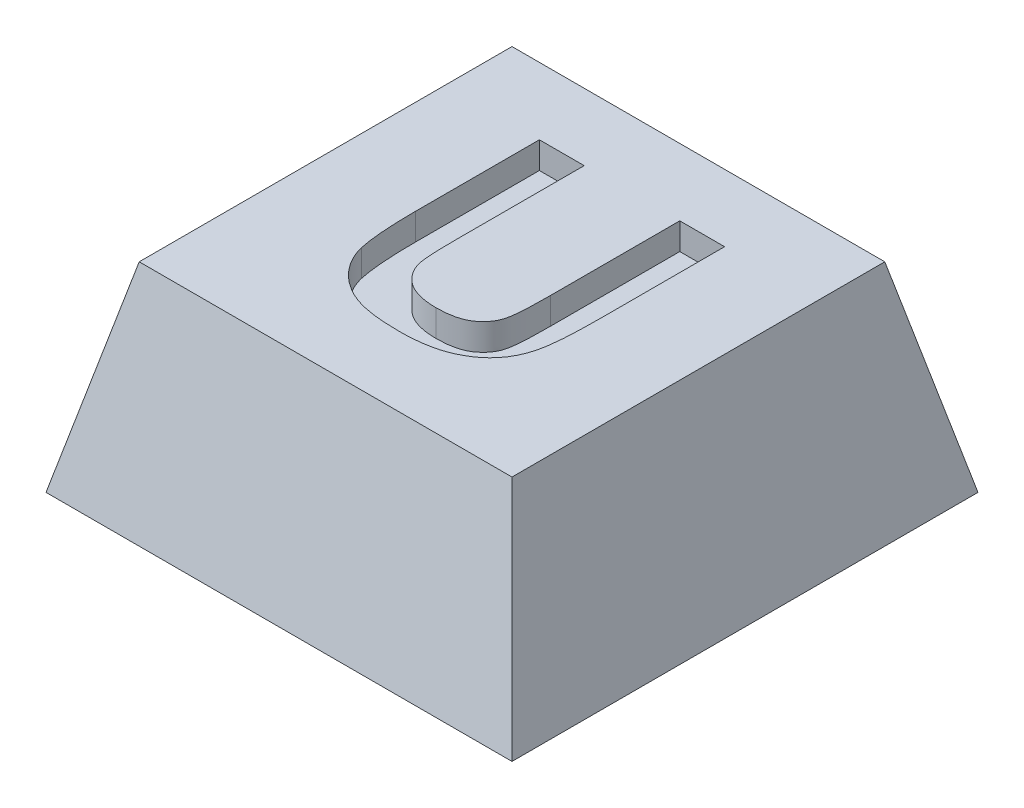
ISO-10303-21;
HEADER;
FILE_DESCRIPTION(('STEP AP214'),'2;1');
FILE_NAME('part.step','',(''),(''),'','','');
FILE_SCHEMA(('AUTOMOTIVE_DESIGN { 1 0 10303 214 1 1 1 1 }'));
ENDSEC;
DATA;
#1=APPLICATION_CONTEXT('core data for automotive mechanical design processes');
#2=APPLICATION_PROTOCOL_DEFINITION('international standard','automotive_design',2000,#1);
#3=PRODUCT_CONTEXT('',#1,'mechanical');
#4=PRODUCT('Part','Part','',(#3));
#5=PRODUCT_RELATED_PRODUCT_CATEGORY('part','',(#4));
#6=PRODUCT_DEFINITION_FORMATION('','',#4);
#7=PRODUCT_DEFINITION_CONTEXT('part definition',#1,'design');
#8=PRODUCT_DEFINITION('design','',#6,#7);
#9=PRODUCT_DEFINITION_SHAPE('','',#8);
#10=(LENGTH_UNIT() NAMED_UNIT(*) SI_UNIT(.MILLI.,.METRE.));
#11=(NAMED_UNIT(*) PLANE_ANGLE_UNIT() SI_UNIT($,.RADIAN.));
#12=(NAMED_UNIT(*) SI_UNIT($,.STERADIAN.) SOLID_ANGLE_UNIT());
#13=UNCERTAINTY_MEASURE_WITH_UNIT(LENGTH_MEASURE(1.E-05),#10,'distance_accuracy_value','');
#14=(GEOMETRIC_REPRESENTATION_CONTEXT(3) GLOBAL_UNCERTAINTY_ASSIGNED_CONTEXT((#13)) GLOBAL_UNIT_ASSIGNED_CONTEXT((#10,
#11,#12)) REPRESENTATION_CONTEXT('',''));
#15=CARTESIAN_POINT('',(0.,0.,0.));
#16=DIRECTION('',(0.,0.,1.));
#17=DIRECTION('',(1.,0.,0.));
#18=AXIS2_PLACEMENT_3D('',#15,#16,#17);
#19=CARTESIAN_POINT('',(0.,3.,0.));
#20=DIRECTION('',(0.,-1.,0.));
#21=DIRECTION('',(0.,0.,-1.));
#22=AXIS2_PLACEMENT_3D('',#19,#20,#21);
#23=PLANE('',#22);
#24=DIRECTION('',(-1.,0.,0.));
#25=VECTOR('',#24,1.);
#26=CARTESIAN_POINT('',(11.,3.,-0.7));
#27=LINE('',#26,#25);
#28=CARTESIAN_POINT('',(6.3,3.,-0.7));
#29=VERTEX_POINT('',#28);
#30=CARTESIAN_POINT('',(0.7,3.,-0.7));
#31=VERTEX_POINT('',#30);
#32=EDGE_CURVE('E66',#29,#31,#27,.T.);
#33=ORIENTED_EDGE('',*,*,#32,.F.);
#34=DIRECTION('',(0.,0.,1.));
#35=VECTOR('',#34,1.);
#36=CARTESIAN_POINT('',(6.3,3.,-7.));
#37=LINE('',#36,#35);
#38=CARTESIAN_POINT('',(6.3,3.,-6.3));
#39=VERTEX_POINT('',#38);
#40=EDGE_CURVE('E207',#39,#29,#37,.T.);
#41=ORIENTED_EDGE('',*,*,#40,.F.);
#42=DIRECTION('',(-1.,0.,0.));
#43=VECTOR('',#42,1.);
#44=CARTESIAN_POINT('',(11.,3.,-6.3));
#45=LINE('',#44,#43);
#46=CARTESIAN_POINT('',(0.699999999999998,3.,-6.3));
#47=VERTEX_POINT('',#46);
#48=EDGE_CURVE('E194',#39,#47,#45,.T.);
#49=ORIENTED_EDGE('',*,*,#48,.T.);
#50=DIRECTION('',(0.,0.,1.));
#51=VECTOR('',#50,1.);
#52=CARTESIAN_POINT('',(0.7,3.,-7.));
#53=LINE('',#52,#51);
#54=EDGE_CURVE('E208',#47,#31,#53,.T.);
#55=ORIENTED_EDGE('',*,*,#54,.T.);
#56=EDGE_LOOP('',(#33,#41,#49,#55));
#57=FACE_BOUND('',#56,.T.);
#58=DIRECTION('',(0.,0.,-1.));
#59=VECTOR('',#58,1.);
#60=CARTESIAN_POINT('',(2.11825671053354,3.,-3.43364218970727));
#61=LINE('',#60,#59);
#62=CARTESIAN_POINT('',(2.11825671053354,3.,-3.43364218970727));
#63=VERTEX_POINT('',#62);
#64=CARTESIAN_POINT('',(2.11825671053354,3.,-5.29301718970727));
#65=VERTEX_POINT('',#64);
#66=EDGE_CURVE('E59',#63,#65,#61,.T.);
#67=ORIENTED_EDGE('',*,*,#66,.T.);
#68=DIRECTION('',(1.,0.,0.));
#69=VECTOR('',#68,1.);
#70=CARTESIAN_POINT('',(2.11825671053354,3.,-5.29301718970727));
#71=LINE('',#70,#69);
#72=CARTESIAN_POINT('',(2.79133363361046,3.,-5.29301718970727));
#73=VERTEX_POINT('',#72);
#74=EDGE_CURVE('E178',#65,#73,#71,.T.);
#75=ORIENTED_EDGE('',*,*,#74,.T.);
#76=DIRECTION('',(0.,0.,1.));
#77=VECTOR('',#76,1.);
#78=CARTESIAN_POINT('',(2.79133363361046,3.,-5.29301718970727));
#79=LINE('',#78,#77);
#80=CARTESIAN_POINT('',(2.79133363361046,3.,-3.39367824739958));
#81=VERTEX_POINT('',#80);
#82=EDGE_CURVE('E562',#73,#81,#79,.T.);
#83=ORIENTED_EDGE('',*,*,#82,.T.);
#84=CARTESIAN_POINT('',(2.79133363361046,3.,-3.39367824739958));
#85=CARTESIAN_POINT('',(2.79159058951141,3.,-3.35768736847698));
#86=CARTESIAN_POINT('',(2.79208114272012,3.,-3.28897736386237));
#87=CARTESIAN_POINT('',(2.7924188179936,3.,-3.1908119289973));
#88=CARTESIAN_POINT('',(2.79428755370598,3.,-3.10267455181293));
#89=CARTESIAN_POINT('',(2.79834009069351,3.,-3.02442321187944));
#90=CARTESIAN_POINT('',(2.80112145876494,3.,-2.95609781623993));
#91=CARTESIAN_POINT('',(2.80628615700011,3.,-2.89768582464791));
#92=CARTESIAN_POINT('',(2.81143833836728,3.,-2.84920998529375));
#93=CARTESIAN_POINT('',(2.8164474963245,3.,-2.82037615527109));
#94=CARTESIAN_POINT('',(2.81867738361046,3.,-2.80754042688676));
#95=B_SPLINE_CURVE_WITH_KNOTS('',3,(#84,#85,#86,#87,#88,#89,#90,#91,#92,#93,#94),.UNSPECIFIED.,
.F.,.F.,(4,1,1,1,1,1,1,1,4),(0.,0.183825007060264,0.350939389686892,0.501381121480457,
0.634009924722663,0.75113916001217,0.85056330440193,0.933476446457445,1.),.UNSPECIFIED.);
#96=CARTESIAN_POINT('',(2.81867738361046,3.,-2.80754042688676));
#97=VERTEX_POINT('',#96);
#98=EDGE_CURVE('E557',#81,#97,#95,.T.);
#99=ORIENTED_EDGE('',*,*,#98,.T.);
#100=CARTESIAN_POINT('',(2.81867738361046,3.,-2.80754042688676));
#101=CARTESIAN_POINT('',(2.8278706557609,3.,-2.77293717894445));
#102=CARTESIAN_POINT('',(2.84597336928102,3.,-2.70479901506601));
#103=CARTESIAN_POINT('',(2.89587110487312,3.,-2.61165595386306));
#104=CARTESIAN_POINT('',(2.96178530901125,3.,-2.52955621095545));
#105=CARTESIAN_POINT('',(3.02902022735564,3.,-2.47100587847671));
#106=CARTESIAN_POINT('',(3.08983939033886,3.,-2.42956829777976));
#107=CARTESIAN_POINT('',(3.14150028578501,3.,-2.40434878879185));
#108=CARTESIAN_POINT('',(3.19631215864889,3.,-2.38135958467606));
#109=CARTESIAN_POINT('',(3.25543376065886,3.,-2.36372016282051));
#110=CARTESIAN_POINT('',(3.3182305632906,3.,-2.34828503435642));
#111=CARTESIAN_POINT('',(3.38546108562211,3.,-2.33936033475784));
#112=CARTESIAN_POINT('',(3.45655794152469,3.,-2.33251084984938));
#113=CARTESIAN_POINT('',(3.50529030878881,3.,-2.33182892125537));
#114=CARTESIAN_POINT('',(3.53031600540534,3.,-2.33147872816881));
#115=B_SPLINE_CURVE_WITH_KNOTS('',3,(#100,#101,#102,#103,#104,#105,#106,#107,#108,#109,#110,
#111,#112,#113,#114),.UNSPECIFIED.,.F.,.F.,(4,1,1,1,1,1,1,1,1,1,1,1,4),(0.,0.114743421271191,
0.22594428290622,0.336552611577657,0.451504771280934,0.511079547906043,0.572546352604733,
0.635866479310683,0.701907532163574,0.770586403165963,0.843449734748019,0.919606215265516,1.),.UNSPECIFIED.);
#116=CARTESIAN_POINT('',(3.53031600540534,3.,-2.33147872816881));
#117=VERTEX_POINT('',#116);
#118=EDGE_CURVE('E547',#97,#117,#115,.T.);
#119=ORIENTED_EDGE('',*,*,#118,.T.);
#120=CARTESIAN_POINT('',(3.53031600540534,3.,-2.33147872816881));
#121=CARTESIAN_POINT('',(3.55556419717022,3.,-2.33193665140718));
#122=CARTESIAN_POINT('',(3.60472191096495,3.,-2.33282821860144));
#123=CARTESIAN_POINT('',(3.67595983039916,3.,-2.33813781258919));
#124=CARTESIAN_POINT('',(3.74242359123935,3.,-2.34815518597234));
#125=CARTESIAN_POINT('',(3.80407253527364,3.,-2.36128989700301));
#126=CARTESIAN_POINT('',(3.8612322702574,3.,-2.37788997047793));
#127=CARTESIAN_POINT('',(3.91344678502505,3.,-2.39890761477416));
#128=CARTESIAN_POINT('',(3.960633796973,3.,-2.42420044434323));
#129=CARTESIAN_POINT('',(4.01607782452567,3.,-2.46232298827674));
#130=CARTESIAN_POINT('',(4.07573552578467,3.,-2.51610149189697));
#131=CARTESIAN_POINT('',(4.13314844621875,3.,-2.58922023729159));
#132=CARTESIAN_POINT('',(4.17423842475938,3.,-2.66993537802751));
#133=CARTESIAN_POINT('',(4.19351136611538,3.,-2.74363433884562));
#134=CARTESIAN_POINT('',(4.20341701063227,3.,-2.80784598051888));
#135=CARTESIAN_POINT('',(4.20945206203609,3.,-2.86403339665256));
#136=CARTESIAN_POINT('',(4.21497142158267,3.,-2.92761805574264));
#137=CARTESIAN_POINT('',(4.21998342224808,3.,-2.99842580037893));
#138=CARTESIAN_POINT('',(4.22341098794886,3.,-3.07650978009094));
#139=CARTESIAN_POINT('',(4.22526489824002,3.,-3.16206747441928));
#140=CARTESIAN_POINT('',(4.2267239353615,3.,-3.25508523863521));
#141=CARTESIAN_POINT('',(4.22705799518012,3.,-3.31959241422902));
#142=CARTESIAN_POINT('',(4.2272310695079,3.,-3.35301318329701));
#143=B_SPLINE_CURVE_WITH_KNOTS('',3,(#120,#121,#122,#123,#124,#125,#126,#127,#128,#129,#130,
#131,#132,#133,#134,#135,#136,#137,#138,#139,#140,#141,#142),.UNSPECIFIED.,.F.,.F.,(4,1,1,1,1,1,
1,1,1,1,1,1,1,1,1,1,1,1,1,1,4),(0.,0.0518438119306666,0.100938843171358,0.146542287812453,
0.189742133284701,0.230280246580349,0.268596217760667,0.30509323438548,0.33996418344798,
0.406554529976919,0.469135901134995,0.529866816686716,0.591101794550841,0.624629557038698,
0.663259733719709,0.707094516041552,0.755675646503373,0.808993028944534,0.86755245054543,
0.931379743056552,1.),.UNSPECIFIED.);
#144=CARTESIAN_POINT('',(4.2272310695079,3.,-3.35301318329701));
#145=VERTEX_POINT('',#144);
#146=EDGE_CURVE('E556',#117,#145,#143,.T.);
#147=ORIENTED_EDGE('',*,*,#146,.T.);
#148=DIRECTION('',(0.,0.,-1.));
#149=VECTOR('',#148,1.);
#150=CARTESIAN_POINT('',(4.2272310695079,3.,-3.35301318329701));
#151=LINE('',#150,#149);
#152=CARTESIAN_POINT('',(4.2272310695079,3.,-5.29301718970727));
#153=VERTEX_POINT('',#152);
#154=EDGE_CURVE('E583',#145,#153,#151,.T.);
#155=ORIENTED_EDGE('',*,*,#154,.T.);
#156=DIRECTION('',(1.,0.,0.));
#157=VECTOR('',#156,1.);
#158=CARTESIAN_POINT('',(4.2272310695079,3.,-5.29301718970727));
#159=LINE('',#158,#157);
#160=CARTESIAN_POINT('',(4.90030799258482,3.,-5.29301718970727));
#161=VERTEX_POINT('',#160);
#162=EDGE_CURVE('E590',#153,#161,#159,.T.);
#163=ORIENTED_EDGE('',*,*,#162,.T.);
#164=DIRECTION('',(0.,0.,1.));
#165=VECTOR('',#164,1.);
#166=CARTESIAN_POINT('',(4.90030799258482,3.,-5.29301718970727));
#167=LINE('',#166,#165);
#168=CARTESIAN_POINT('',(4.90030799258482,3.,-3.46238818329701));
#169=VERTEX_POINT('',#168);
#170=EDGE_CURVE('E594',#161,#169,#167,.T.);
#171=ORIENTED_EDGE('',*,*,#170,.T.);
#172=CARTESIAN_POINT('',(4.90030799258482,3.,-3.46238818329702));
#173=CARTESIAN_POINT('',(4.90022172292996,3.,-3.41190690880102));
#174=CARTESIAN_POINT('',(4.90005595815898,3.,-3.31490852717624));
#175=CARTESIAN_POINT('',(4.89746777177614,3.,-3.17535205677515));
#176=CARTESIAN_POINT('',(4.89196705444676,3.,-3.04731484577185));
#177=CARTESIAN_POINT('',(4.88736067837094,3.,-2.93057741913428));
#178=CARTESIAN_POINT('',(4.87847516828992,3.,-2.82543758612459));
#179=CARTESIAN_POINT('',(4.86917206958176,3.,-2.73182997491537));
#180=CARTESIAN_POINT('',(4.85718756009229,3.,-2.6497709447995));
#181=CARTESIAN_POINT('',(4.84009753799659,3.,-2.55649893221663));
#182=CARTESIAN_POINT('',(4.81137664457265,3.,-2.45185373531345));
#183=CARTESIAN_POINT('',(4.76508843933388,3.,-2.33625969489549));
#184=CARTESIAN_POINT('',(4.70593072162474,3.,-2.23109386202453));
#185=CARTESIAN_POINT('',(4.63413922319297,3.,-2.1359527261188));
#186=CARTESIAN_POINT('',(4.55012752072571,3.,-2.05045814604782));
#187=CARTESIAN_POINT('',(4.45263771682141,3.,-1.97494622981607));
#188=CARTESIAN_POINT('',(4.34267229471177,3.,-1.90849896532287));
#189=CARTESIAN_POINT('',(4.24190168528171,3.,-1.86065278262511));
#190=CARTESIAN_POINT('',(4.15404262439026,3.,-1.82843473114555));
#191=CARTESIAN_POINT('',(4.08248288856089,3.,-1.80663099759483));
#192=CARTESIAN_POINT('',(4.00589756293172,3.,-1.78847304918121));
#193=CARTESIAN_POINT('',(3.92437646854737,3.,-1.77406310214242));
#194=CARTESIAN_POINT('',(3.83788457654613,3.,-1.76191338502257));
#195=CARTESIAN_POINT('',(3.74639048357668,3.,-1.75379936468534));
#196=CARTESIAN_POINT('',(3.65003261148225,3.,-1.74873564371268));
#197=CARTESIAN_POINT('',(3.58430909343863,3.,-1.74834530720141));
#198=CARTESIAN_POINT('',(3.55064853745662,3.,-1.74814539483548));
#199=B_SPLINE_CURVE_WITH_KNOTS('',3,(#172,#173,#174,#175,#176,#177,#178,#179,#180,#181,#182,
#183,#184,#185,#186,#187,#188,#189,#190,#191,#192,#193,#194,#195,#196,#197,#198),.UNSPECIFIED.,
.F.,.F.,(4,1,1,1,1,1,1,1,1,1,1,1,1,1,1,1,1,1,1,1,1,1,1,1,4),(0.,0.058982251866515,
0.113332776019573,0.163066996848931,0.208720820432053,0.249811139834419,0.286329176157329,
0.318613036661102,0.346676161329656,0.397089399385359,0.445108917572501,0.49181547303063,
0.537635583766378,0.583977529790645,0.631444968953472,0.681319919045405,0.733844646315688,
0.761490173539024,0.790600539422322,0.821199444835878,0.853389629847076,0.887295661622406,
0.923216688702173,0.960675127787456,1.),.UNSPECIFIED.);
#200=CARTESIAN_POINT('',(3.55064853745662,3.,-1.74814539483548));
#201=VERTEX_POINT('',#200);
#202=EDGE_CURVE('E598',#169,#201,#199,.T.);
#203=ORIENTED_EDGE('',*,*,#202,.T.);
#204=CARTESIAN_POINT('',(3.55064853745662,3.,-1.74814539483548));
#205=CARTESIAN_POINT('',(3.51021434728701,3.,-1.74866224884397));
#206=CARTESIAN_POINT('',(3.43188729339117,3.,-1.74966347210602));
#207=CARTESIAN_POINT('',(3.31818906285651,3.,-1.75412984327711));
#208=CARTESIAN_POINT('',(3.21225124567553,3.,-1.76334860404892));
#209=CARTESIAN_POINT('',(3.11374100494762,3.,-1.77580862242184));
#210=CARTESIAN_POINT('',(3.02269901356326,3.,-1.79182638346425));
#211=CARTESIAN_POINT('',(2.93889495671294,3.,-1.81097551662833));
#212=CARTESIAN_POINT('',(2.86299788741923,3.,-1.83517731887616));
#213=CARTESIAN_POINT('',(2.77259838705882,3.,-1.86974334383618));
#214=CARTESIAN_POINT('',(2.67183306408483,3.,-1.9226177742413));
#215=CARTESIAN_POINT('',(2.56214574695217,3.,-1.9931518342703));
#216=CARTESIAN_POINT('',(2.46585914510612,3.,-2.0727620443855));
#217=CARTESIAN_POINT('',(2.3838192814199,3.,-2.16067051305769));
#218=CARTESIAN_POINT('',(2.31523714842208,3.,-2.2537879371028));
#219=CARTESIAN_POINT('',(2.25949199154255,3.,-2.35009935825425));
#220=CARTESIAN_POINT('',(2.21481965775545,3.,-2.44799948376074));
#221=CARTESIAN_POINT('',(2.19615302070669,3.,-2.51604198706442));
#222=CARTESIAN_POINT('',(2.18696664643098,3.,-2.54952760637394));
#223=B_SPLINE_CURVE_WITH_KNOTS('',3,(#204,#205,#206,#207,#208,#209,#210,#211,#212,#213,#214,
#215,#216,#217,#218,#219,#220,#221,#222),.UNSPECIFIED.,.F.,.F.,(4,1,1,1,1,1,1,1,1,1,1,1,1,1,1,1,
4),(0.,0.0705383458906594,0.136643291163387,0.198429902465619,0.25597418052394,
0.309794976232589,0.359633117755365,0.405792277216816,0.448642759284464,0.528318939757397,
0.603739881743586,0.675824581819639,0.745623938691081,0.812974235955688,0.877093332418524,
0.939514190668938,1.),.UNSPECIFIED.);
#224=CARTESIAN_POINT('',(2.18696664643098,3.,-2.54952760637394));
#225=VERTEX_POINT('',#224);
#226=EDGE_CURVE('E604',#201,#225,#223,.T.);
#227=ORIENTED_EDGE('',*,*,#226,.T.);
#228=CARTESIAN_POINT('',(2.18696664643098,3.,-2.54952760637394));
#229=CARTESIAN_POINT('',(2.18134426175389,3.,-2.57589046465025));
#230=CARTESIAN_POINT('',(2.16950172171168,3.,-2.63141907442974));
#231=CARTESIAN_POINT('',(2.15605188340251,3.,-2.71969867853388));
#232=CARTESIAN_POINT('',(2.14378166796499,3.,-2.8169093080754));
#233=CARTESIAN_POINT('',(2.13540095063567,3.,-2.92316594646986));
#234=CARTESIAN_POINT('',(2.12745679825847,3.,-3.03813146097455));
#235=CARTESIAN_POINT('',(2.12175317795555,3.,-3.16202261990794));
#236=CARTESIAN_POINT('',(2.11940784408804,3.,-3.2948112910508));
#237=CARTESIAN_POINT('',(2.1186481518535,3.,-3.38643294104239));
#238=CARTESIAN_POINT('',(2.11825671053354,3.,-3.43364218970727));
#239=B_SPLINE_CURVE_WITH_KNOTS('',3,(#228,#229,#230,#231,#232,#233,#234,#235,#236,#237,#238),
.UNSPECIFIED.,.F.,.F.,(4,1,1,1,1,1,1,1,4),(0.,0.0910089497500999,0.191693950790411,
0.301427787431466,0.421825191502953,0.55154595606244,0.690589809294284,0.840572368716176,1.),.UNSPECIFIED.);
#240=EDGE_CURVE('E174',#225,#63,#239,.T.);
#241=ORIENTED_EDGE('',*,*,#240,.T.);
#242=EDGE_LOOP('',(#67,#75,#83,#99,#119,#147,#155,#163,#171,#203,#227,#241));
#243=FACE_BOUND('',#242,.T.);
#244=ADVANCED_FACE('F43',(#57,#243),#23,.F.);
#245=CARTESIAN_POINT('',(7.,0.,-7.));
#246=DIRECTION('',(-0.973841209741793,-0.227229615606418,0.));
#247=DIRECTION('',(0.227229615606418,-0.973841209741793,0.));
#248=AXIS2_PLACEMENT_3D('',#245,#246,#247);
#249=PLANE('',#248);
#250=DIRECTION('',(-0.221581128241521,0.949633406749377,-0.221581128241521));
#251=VECTOR('',#250,1.);
#252=CARTESIAN_POINT('',(6.6563126252505,1.47294589178357,-0.343687374749499));
#253=LINE('',#252,#251);
#254=CARTESIAN_POINT('',(7.,0.,0.));
#255=VERTEX_POINT('',#254);
#256=EDGE_CURVE('E204',#255,#29,#253,.T.);
#257=ORIENTED_EDGE('',*,*,#256,.F.);
#258=DIRECTION('',(0.,0.,-1.));
#259=VECTOR('',#258,1.);
#260=CARTESIAN_POINT('',(7.,0.,0.));
#261=LINE('',#260,#259);
#262=CARTESIAN_POINT('',(7.,0.,-7.));
#263=VERTEX_POINT('',#262);
#264=EDGE_CURVE('E222',#255,#263,#261,.T.);
#265=ORIENTED_EDGE('',*,*,#264,.T.);
#266=DIRECTION('',(0.221581128241521,-0.949633406749377,-0.221581128241521));
#267=VECTOR('',#266,1.);
#268=CARTESIAN_POINT('',(7.,0.,-7.));
#269=LINE('',#268,#267);
#270=EDGE_CURVE('E198',#39,#263,#269,.T.);
#271=ORIENTED_EDGE('',*,*,#270,.F.);
#272=ORIENTED_EDGE('',*,*,#40,.T.);
#273=EDGE_LOOP('',(#257,#265,#271,#272));
#274=FACE_BOUND('',#273,.T.);
#275=ADVANCED_FACE('F247',(#274),#249,.F.);
#276=CARTESIAN_POINT('',(0.,0.,-7.));
#277=DIRECTION('',(0.973841209741793,-0.227229615606418,0.));
#278=DIRECTION('',(0.227229615606418,0.973841209741793,0.));
#279=AXIS2_PLACEMENT_3D('',#276,#277,#278);
#280=PLANE('',#279);
#281=DIRECTION('',(-0.221581128241521,-0.949633406749378,0.221581128241521));
#282=VECTOR('',#281,1.);
#283=CARTESIAN_POINT('',(0.343687374749499,1.47294589178357,-0.3436873747495));
#284=LINE('',#283,#282);
#285=CARTESIAN_POINT('',(0.,0.,0.));
#286=VERTEX_POINT('',#285);
#287=EDGE_CURVE('E11',#31,#286,#284,.T.);
#288=ORIENTED_EDGE('',*,*,#287,.F.);
#289=ORIENTED_EDGE('',*,*,#54,.F.);
#290=DIRECTION('',(0.221581128241521,0.949633406749377,0.221581128241521));
#291=VECTOR('',#290,1.);
#292=CARTESIAN_POINT('',(0.,0.,-7.));
#293=LINE('',#292,#291);
#294=CARTESIAN_POINT('',(0.,0.,-7.));
#295=VERTEX_POINT('',#294);
#296=EDGE_CURVE('E52',#295,#47,#293,.T.);
#297=ORIENTED_EDGE('',*,*,#296,.F.);
#298=DIRECTION('',(0.,0.,1.));
#299=VECTOR('',#298,1.);
#300=CARTESIAN_POINT('',(0.,0.,0.));
#301=LINE('',#300,#299);
#302=EDGE_CURVE('E212',#295,#286,#301,.T.);
#303=ORIENTED_EDGE('',*,*,#302,.T.);
#304=EDGE_LOOP('',(#288,#289,#297,#303));
#305=FACE_BOUND('',#304,.T.);
#306=ADVANCED_FACE('F240',(#305),#280,.F.);
#307=CARTESIAN_POINT('',(0.,0.,0.));
#308=DIRECTION('',(0.,-1.,0.));
#309=DIRECTION('',(0.,0.,-1.));
#310=AXIS2_PLACEMENT_3D('',#307,#308,#309);
#311=PLANE('',#310);
#312=CARTESIAN_POINT('',(3.5,0.,-3.5));
#313=DIRECTION('',(0.,-1.,0.));
#314=DIRECTION('',(0.,0.,-1.));
#315=AXIS2_PLACEMENT_3D('',#312,#313,#314);
#316=CIRCLE('',#315,1.8);
#317=CARTESIAN_POINT('',(3.5,0.,-5.3));
#318=VERTEX_POINT('',#317);
#319=EDGE_CURVE('E180',#318,#318,#316,.T.);
#320=ORIENTED_EDGE('',*,*,#319,.F.);
#321=EDGE_LOOP('',(#320));
#322=FACE_BOUND('',#321,.T.);
#323=ORIENTED_EDGE('',*,*,#302,.F.);
#324=DIRECTION('',(-1.,0.,0.));
#325=VECTOR('',#324,1.);
#326=CARTESIAN_POINT('',(0.,0.,-7.));
#327=LINE('',#326,#325);
#328=EDGE_CURVE('E226',#263,#295,#327,.T.);
#329=ORIENTED_EDGE('',*,*,#328,.F.);
#330=ORIENTED_EDGE('',*,*,#264,.F.);
#331=DIRECTION('',(1.,0.,0.));
#332=VECTOR('',#331,1.);
#333=CARTESIAN_POINT('',(0.,0.,0.));
#334=LINE('',#333,#332);
#335=EDGE_CURVE('E219',#286,#255,#334,.T.);
#336=ORIENTED_EDGE('',*,*,#335,.F.);
#337=EDGE_LOOP('',(#323,#329,#330,#336));
#338=FACE_BOUND('',#337,.T.);
#339=ADVANCED_FACE('F45',(#322,#338),#311,.T.);
#340=CARTESIAN_POINT('',(11.,3.,-6.3));
#341=DIRECTION('',(0.,0.227229615606418,-0.973841209741793));
#342=DIRECTION('',(0.,0.973841209741793,0.227229615606418));
#343=AXIS2_PLACEMENT_3D('',#340,#341,#342);
#344=PLANE('',#343);
#345=ORIENTED_EDGE('',*,*,#270,.T.);
#346=ORIENTED_EDGE('',*,*,#328,.T.);
#347=ORIENTED_EDGE('',*,*,#296,.T.);
#348=ORIENTED_EDGE('',*,*,#48,.F.);
#349=EDGE_LOOP('',(#345,#346,#347,#348));
#350=FACE_BOUND('',#349,.T.);
#351=ADVANCED_FACE('F231',(#350),#344,.T.);
#352=CARTESIAN_POINT('',(11.,0.,0.));
#353=DIRECTION('',(0.,0.227229615606418,0.973841209741793));
#354=DIRECTION('',(0.,-0.973841209741793,0.227229615606418));
#355=AXIS2_PLACEMENT_3D('',#352,#353,#354);
#356=PLANE('',#355);
#357=ORIENTED_EDGE('',*,*,#256,.T.);
#358=ORIENTED_EDGE('',*,*,#32,.T.);
#359=ORIENTED_EDGE('',*,*,#287,.T.);
#360=ORIENTED_EDGE('',*,*,#335,.T.);
#361=EDGE_LOOP('',(#357,#358,#359,#360));
#362=FACE_BOUND('',#361,.T.);
#363=ADVANCED_FACE('F242',(#362),#356,.T.);
#364=CARTESIAN_POINT('',(3.5,0.8,-3.5));
#365=DIRECTION('',(0.,-1.,0.));
#366=DIRECTION('',(0.,0.,-1.));
#367=AXIS2_PLACEMENT_3D('',#364,#365,#366);
#368=CYLINDRICAL_SURFACE('',#367,1.8);
#369=CARTESIAN_POINT('',(3.5,0.8,-3.5));
#370=DIRECTION('',(0.,-1.,0.));
#371=DIRECTION('',(0.,0.,-1.));
#372=AXIS2_PLACEMENT_3D('',#369,#370,#371);
#373=CIRCLE('',#372,1.8);
#374=CARTESIAN_POINT('',(3.5,0.8,-5.3));
#375=VERTEX_POINT('',#374);
#376=EDGE_CURVE('E186',#375,#375,#373,.T.);
#377=ORIENTED_EDGE('',*,*,#376,.F.);
#378=EDGE_LOOP('',(#377));
#379=FACE_BOUND('',#378,.T.);
#380=ORIENTED_EDGE('',*,*,#319,.T.);
#381=EDGE_LOOP('',(#380));
#382=FACE_BOUND('',#381,.T.);
#383=ADVANCED_FACE('F265',(#379,#382),#368,.F.);
#384=CARTESIAN_POINT('',(3.5,0.8,-3.5));
#385=DIRECTION('',(0.,-1.,0.));
#386=DIRECTION('',(0.,0.,-1.));
#387=AXIS2_PLACEMENT_3D('',#384,#385,#386);
#388=PLANE('',#387);
#389=ORIENTED_EDGE('',*,*,#376,.T.);
#390=EDGE_LOOP('',(#389));
#391=FACE_BOUND('',#390,.T.);
#392=ADVANCED_FACE('F268',(#391),#388,.T.);
#393=CARTESIAN_POINT('',(2.11825671053354,2.6,-3.43364218970727));
#394=DIRECTION('',(1.,0.,0.));
#395=DIRECTION('',(0.,0.,-1.));
#396=AXIS2_PLACEMENT_3D('',#393,#394,#395);
#397=PLANE('',#396);
#398=ORIENTED_EDGE('',*,*,#66,.F.);
#399=DIRECTION('',(0.,1.,0.));
#400=VECTOR('',#399,1.);
#401=CARTESIAN_POINT('',(2.11825671053354,2.6,-3.43364218970727));
#402=LINE('',#401,#400);
#403=CARTESIAN_POINT('',(2.11825671053354,2.6,-3.43364218970727));
#404=VERTEX_POINT('',#403);
#405=EDGE_CURVE('E172',#404,#63,#402,.T.);
#406=ORIENTED_EDGE('',*,*,#405,.F.);
#407=DIRECTION('',(0.,0.,-1.));
#408=VECTOR('',#407,1.);
#409=CARTESIAN_POINT('',(2.11825671053354,2.6,-3.43364218970727));
#410=LINE('',#409,#408);
#411=CARTESIAN_POINT('',(2.11825671053354,2.6,-5.29301718970727));
#412=VERTEX_POINT('',#411);
#413=EDGE_CURVE('E162',#404,#412,#410,.T.);
#414=ORIENTED_EDGE('',*,*,#413,.T.);
#415=DIRECTION('',(0.,1.,0.));
#416=VECTOR('',#415,1.);
#417=CARTESIAN_POINT('',(2.11825671053354,2.6,-5.29301718970727));
#418=LINE('',#417,#416);
#419=EDGE_CURVE('E171',#412,#65,#418,.T.);
#420=ORIENTED_EDGE('',*,*,#419,.T.);
#421=EDGE_LOOP('',(#398,#406,#414,#420));
#422=FACE_BOUND('',#421,.T.);
#423=ADVANCED_FACE('F170',(#422),#397,.T.);
#424=CARTESIAN_POINT('',(2.11825671053354,2.6,-5.29301718970727));
#425=DIRECTION('',(0.,0.,1.));
#426=DIRECTION('',(1.,0.,0.));
#427=AXIS2_PLACEMENT_3D('',#424,#425,#426);
#428=PLANE('',#427);
#429=ORIENTED_EDGE('',*,*,#74,.F.);
#430=ORIENTED_EDGE('',*,*,#419,.F.);
#431=DIRECTION('',(1.,0.,0.));
#432=VECTOR('',#431,1.);
#433=CARTESIAN_POINT('',(2.11825671053354,2.6,-5.29301718970727));
#434=LINE('',#433,#432);
#435=CARTESIAN_POINT('',(2.79133363361046,2.6,-5.29301718970727));
#436=VERTEX_POINT('',#435);
#437=EDGE_CURVE('E158',#412,#436,#434,.T.);
#438=ORIENTED_EDGE('',*,*,#437,.T.);
#439=DIRECTION('',(0.,1.,0.));
#440=VECTOR('',#439,1.);
#441=CARTESIAN_POINT('',(2.79133363361046,2.6,-5.29301718970727));
#442=LINE('',#441,#440);
#443=EDGE_CURVE('E181',#436,#73,#442,.T.);
#444=ORIENTED_EDGE('',*,*,#443,.T.);
#445=EDGE_LOOP('',(#429,#430,#438,#444));
#446=FACE_BOUND('',#445,.T.);
#447=ADVANCED_FACE('F176',(#446),#428,.T.);
#448=CARTESIAN_POINT('',(2.79133363361046,2.6,-5.29301718970727));
#449=DIRECTION('',(-1.,0.,0.));
#450=DIRECTION('',(0.,0.,1.));
#451=AXIS2_PLACEMENT_3D('',#448,#449,#450);
#452=PLANE('',#451);
#453=ORIENTED_EDGE('',*,*,#82,.F.);
#454=ORIENTED_EDGE('',*,*,#443,.F.);
#455=DIRECTION('',(0.,0.,1.));
#456=VECTOR('',#455,1.);
#457=CARTESIAN_POINT('',(2.79133363361046,2.6,-5.29301718970727));
#458=LINE('',#457,#456);
#459=CARTESIAN_POINT('',(2.79133363361046,2.6,-3.39367824739958));
#460=VERTEX_POINT('',#459);
#461=EDGE_CURVE('E164',#436,#460,#458,.T.);
#462=ORIENTED_EDGE('',*,*,#461,.T.);
#463=DIRECTION('',(0.,1.,0.));
#464=VECTOR('',#463,1.);
#465=CARTESIAN_POINT('',(2.79133363361046,2.6,-3.39367824739958));
#466=LINE('',#465,#464);
#467=EDGE_CURVE('E188',#460,#81,#466,.T.);
#468=ORIENTED_EDGE('',*,*,#467,.T.);
#469=EDGE_LOOP('',(#453,#454,#462,#468));
#470=FACE_BOUND('',#469,.T.);
#471=ADVANCED_FACE('F277',(#470),#452,.T.);
#472=CARTESIAN_POINT('',(2.79133363361046,2.6,-3.39367824739958));
#473=CARTESIAN_POINT('',(2.79159058951141,2.6,-3.35768736847698));
#474=CARTESIAN_POINT('',(2.79208114272012,2.6,-3.28897736386237));
#475=CARTESIAN_POINT('',(2.7924188179936,2.6,-3.1908119289973));
#476=CARTESIAN_POINT('',(2.79428755370598,2.6,-3.10267455181293));
#477=CARTESIAN_POINT('',(2.79834009069351,2.6,-3.02442321187944));
#478=CARTESIAN_POINT('',(2.80112145876494,2.6,-2.95609781623993));
#479=CARTESIAN_POINT('',(2.80628615700011,2.6,-2.89768582464791));
#480=CARTESIAN_POINT('',(2.81143833836728,2.6,-2.84920998529375));
#481=CARTESIAN_POINT('',(2.8164474963245,2.6,-2.82037615527109));
#482=CARTESIAN_POINT('',(2.81867738361046,2.6,-2.80754042688676));
#483=B_SPLINE_CURVE_WITH_KNOTS('',3,(#472,#473,#474,#475,#476,#477,#478,#479,#480,#481,#482),
.UNSPECIFIED.,.F.,.F.,(4,1,1,1,1,1,1,1,4),(0.,0.183825007060264,0.350939389686892,
0.501381121480457,0.634009924722663,0.75113916001217,0.85056330440193,0.933476446457445,1.),.UNSPECIFIED.);
#484=DIRECTION('',(0.,1.,0.));
#485=VECTOR('',#484,1.);
#486=SURFACE_OF_LINEAR_EXTRUSION('',#483,#485);
#487=ORIENTED_EDGE('',*,*,#98,.F.);
#488=ORIENTED_EDGE('',*,*,#467,.F.);
#489=CARTESIAN_POINT('',(2.81867738361046,2.6,-2.80754042688676));
#490=VERTEX_POINT('',#489);
#491=EDGE_CURVE('E289',#460,#490,#483,.T.);
#492=ORIENTED_EDGE('',*,*,#491,.T.);
#493=DIRECTION('',(0.,1.,0.));
#494=VECTOR('',#493,1.);
#495=CARTESIAN_POINT('',(2.81867738361046,2.6,-2.80754042688676));
#496=LINE('',#495,#494);
#497=EDGE_CURVE('E549',#490,#97,#496,.T.);
#498=ORIENTED_EDGE('',*,*,#497,.T.);
#499=EDGE_LOOP('',(#487,#488,#492,#498));
#500=FACE_BOUND('',#499,.T.);
#501=ADVANCED_FACE('F280',(#500),#486,.T.);
#502=CARTESIAN_POINT('',(2.81867738361046,2.6,-2.80754042688676));
#503=CARTESIAN_POINT('',(2.8278706557609,2.6,-2.77293717894445));
#504=CARTESIAN_POINT('',(2.84597336928102,2.6,-2.70479901506601));
#505=CARTESIAN_POINT('',(2.89587110487312,2.6,-2.61165595386306));
#506=CARTESIAN_POINT('',(2.96178530901125,2.6,-2.52955621095545));
#507=CARTESIAN_POINT('',(3.02902022735564,2.6,-2.47100587847671));
#508=CARTESIAN_POINT('',(3.08983939033886,2.6,-2.42956829777976));
#509=CARTESIAN_POINT('',(3.14150028578501,2.6,-2.40434878879185));
#510=CARTESIAN_POINT('',(3.19631215864889,2.6,-2.38135958467606));
#511=CARTESIAN_POINT('',(3.25543376065886,2.6,-2.36372016282051));
#512=CARTESIAN_POINT('',(3.3182305632906,2.6,-2.34828503435642));
#513=CARTESIAN_POINT('',(3.38546108562211,2.6,-2.33936033475784));
#514=CARTESIAN_POINT('',(3.45655794152469,2.6,-2.33251084984938));
#515=CARTESIAN_POINT('',(3.50529030878881,2.6,-2.33182892125537));
#516=CARTESIAN_POINT('',(3.53031600540534,2.6,-2.33147872816881));
#517=B_SPLINE_CURVE_WITH_KNOTS('',3,(#502,#503,#504,#505,#506,#507,#508,#509,#510,#511,#512,
#513,#514,#515,#516),.UNSPECIFIED.,.F.,.F.,(4,1,1,1,1,1,1,1,1,1,1,1,4),(0.,0.114743421271191,
0.22594428290622,0.336552611577657,0.451504771280934,0.511079547906043,0.572546352604733,
0.635866479310683,0.701907532163574,0.770586403165963,0.843449734748019,0.919606215265516,1.),.UNSPECIFIED.);
#518=DIRECTION('',(0.,1.,0.));
#519=VECTOR('',#518,1.);
#520=SURFACE_OF_LINEAR_EXTRUSION('',#517,#519);
#521=ORIENTED_EDGE('',*,*,#118,.F.);
#522=ORIENTED_EDGE('',*,*,#497,.F.);
#523=CARTESIAN_POINT('',(3.53031600540534,2.6,-2.33147872816881));
#524=VERTEX_POINT('',#523);
#525=EDGE_CURVE('E295',#490,#524,#517,.T.);
#526=ORIENTED_EDGE('',*,*,#525,.T.);
#527=DIRECTION('',(0.,1.,0.));
#528=VECTOR('',#527,1.);
#529=CARTESIAN_POINT('',(3.53031600540534,2.6,-2.33147872816881));
#530=LINE('',#529,#528);
#531=EDGE_CURVE('E552',#524,#117,#530,.T.);
#532=ORIENTED_EDGE('',*,*,#531,.T.);
#533=EDGE_LOOP('',(#521,#522,#526,#532));
#534=FACE_BOUND('',#533,.T.);
#535=ADVANCED_FACE('F285',(#534),#520,.T.);
#536=CARTESIAN_POINT('',(3.53031600540534,2.6,-2.33147872816881));
#537=CARTESIAN_POINT('',(3.55556419717022,2.6,-2.33193665140718));
#538=CARTESIAN_POINT('',(3.60472191096495,2.6,-2.33282821860144));
#539=CARTESIAN_POINT('',(3.67595983039916,2.6,-2.33813781258919));
#540=CARTESIAN_POINT('',(3.74242359123935,2.6,-2.34815518597234));
#541=CARTESIAN_POINT('',(3.80407253527364,2.6,-2.36128989700301));
#542=CARTESIAN_POINT('',(3.8612322702574,2.6,-2.37788997047793));
#543=CARTESIAN_POINT('',(3.91344678502505,2.6,-2.39890761477416));
#544=CARTESIAN_POINT('',(3.960633796973,2.6,-2.42420044434323));
#545=CARTESIAN_POINT('',(4.01607782452567,2.6,-2.46232298827674));
#546=CARTESIAN_POINT('',(4.07573552578467,2.6,-2.51610149189697));
#547=CARTESIAN_POINT('',(4.13314844621875,2.6,-2.58922023729159));
#548=CARTESIAN_POINT('',(4.17423842475938,2.6,-2.66993537802751));
#549=CARTESIAN_POINT('',(4.19351136611538,2.6,-2.74363433884562));
#550=CARTESIAN_POINT('',(4.20341701063227,2.6,-2.80784598051888));
#551=CARTESIAN_POINT('',(4.20945206203609,2.6,-2.86403339665256));
#552=CARTESIAN_POINT('',(4.21497142158267,2.6,-2.92761805574264));
#553=CARTESIAN_POINT('',(4.21998342224808,2.6,-2.99842580037893));
#554=CARTESIAN_POINT('',(4.22341098794886,2.6,-3.07650978009094));
#555=CARTESIAN_POINT('',(4.22526489824002,2.6,-3.16206747441928));
#556=CARTESIAN_POINT('',(4.2267239353615,2.6,-3.25508523863521));
#557=CARTESIAN_POINT('',(4.22705799518012,2.6,-3.31959241422902));
#558=CARTESIAN_POINT('',(4.2272310695079,2.6,-3.35301318329701));
#559=B_SPLINE_CURVE_WITH_KNOTS('',3,(#536,#537,#538,#539,#540,#541,#542,#543,#544,#545,#546,
#547,#548,#549,#550,#551,#552,#553,#554,#555,#556,#557,#558),.UNSPECIFIED.,.F.,.F.,(4,1,1,1,1,1,
1,1,1,1,1,1,1,1,1,1,1,1,1,1,4),(0.,0.0518438119306666,0.100938843171358,0.146542287812453,
0.189742133284701,0.230280246580349,0.268596217760667,0.30509323438548,0.33996418344798,
0.406554529976919,0.469135901134995,0.529866816686716,0.591101794550841,0.624629557038698,
0.663259733719709,0.707094516041552,0.755675646503373,0.808993028944534,0.86755245054543,
0.931379743056552,1.),.UNSPECIFIED.);
#560=DIRECTION('',(0.,1.,0.));
#561=VECTOR('',#560,1.);
#562=SURFACE_OF_LINEAR_EXTRUSION('',#559,#561);
#563=ORIENTED_EDGE('',*,*,#146,.F.);
#564=ORIENTED_EDGE('',*,*,#531,.F.);
#565=CARTESIAN_POINT('',(4.2272310695079,2.6,-3.35301318329701));
#566=VERTEX_POINT('',#565);
#567=EDGE_CURVE('E304',#524,#566,#559,.T.);
#568=ORIENTED_EDGE('',*,*,#567,.T.);
#569=DIRECTION('',(0.,1.,0.));
#570=VECTOR('',#569,1.);
#571=CARTESIAN_POINT('',(4.2272310695079,2.6,-3.35301318329701));
#572=LINE('',#571,#570);
#573=EDGE_CURVE('E641',#566,#145,#572,.T.);
#574=ORIENTED_EDGE('',*,*,#573,.T.);
#575=EDGE_LOOP('',(#563,#564,#568,#574));
#576=FACE_BOUND('',#575,.T.);
#577=ADVANCED_FACE('F318',(#576),#562,.T.);
#578=CARTESIAN_POINT('',(4.2272310695079,2.6,-3.35301318329701));
#579=DIRECTION('',(1.,0.,0.));
#580=DIRECTION('',(0.,0.,-1.));
#581=AXIS2_PLACEMENT_3D('',#578,#579,#580);
#582=PLANE('',#581);
#583=ORIENTED_EDGE('',*,*,#154,.F.);
#584=ORIENTED_EDGE('',*,*,#573,.F.);
#585=DIRECTION('',(0.,0.,-1.));
#586=VECTOR('',#585,1.);
#587=CARTESIAN_POINT('',(4.2272310695079,2.6,-3.35301318329701));
#588=LINE('',#587,#586);
#589=CARTESIAN_POINT('',(4.2272310695079,2.6,-5.29301718970727));
#590=VERTEX_POINT('',#589);
#591=EDGE_CURVE('E313',#566,#590,#588,.T.);
#592=ORIENTED_EDGE('',*,*,#591,.T.);
#593=DIRECTION('',(0.,1.,0.));
#594=VECTOR('',#593,1.);
#595=CARTESIAN_POINT('',(4.2272310695079,2.6,-5.29301718970727));
#596=LINE('',#595,#594);
#597=EDGE_CURVE('E638',#590,#153,#596,.T.);
#598=ORIENTED_EDGE('',*,*,#597,.T.);
#599=EDGE_LOOP('',(#583,#584,#592,#598));
#600=FACE_BOUND('',#599,.T.);
#601=ADVANCED_FACE('F321',(#600),#582,.T.);
#602=CARTESIAN_POINT('',(4.2272310695079,2.6,-5.29301718970727));
#603=DIRECTION('',(0.,0.,1.));
#604=DIRECTION('',(1.,0.,0.));
#605=AXIS2_PLACEMENT_3D('',#602,#603,#604);
#606=PLANE('',#605);
#607=ORIENTED_EDGE('',*,*,#162,.F.);
#608=ORIENTED_EDGE('',*,*,#597,.F.);
#609=DIRECTION('',(1.,0.,0.));
#610=VECTOR('',#609,1.);
#611=CARTESIAN_POINT('',(4.2272310695079,2.6,-5.29301718970727));
#612=LINE('',#611,#610);
#613=CARTESIAN_POINT('',(4.90030799258482,2.6,-5.29301718970727));
#614=VERTEX_POINT('',#613);
#615=EDGE_CURVE('E657',#590,#614,#612,.T.);
#616=ORIENTED_EDGE('',*,*,#615,.T.);
#617=DIRECTION('',(0.,1.,0.));
#618=VECTOR('',#617,1.);
#619=CARTESIAN_POINT('',(4.90030799258482,2.6,-5.29301718970727));
#620=LINE('',#619,#618);
#621=EDGE_CURVE('E635',#614,#161,#620,.T.);
#622=ORIENTED_EDGE('',*,*,#621,.T.);
#623=EDGE_LOOP('',(#607,#608,#616,#622));
#624=FACE_BOUND('',#623,.T.);
#625=ADVANCED_FACE('F325',(#624),#606,.T.);
#626=CARTESIAN_POINT('',(4.90030799258482,2.6,-5.29301718970727));
#627=DIRECTION('',(-1.,0.,0.));
#628=DIRECTION('',(0.,0.,1.));
#629=AXIS2_PLACEMENT_3D('',#626,#627,#628);
#630=PLANE('',#629);
#631=ORIENTED_EDGE('',*,*,#170,.F.);
#632=ORIENTED_EDGE('',*,*,#621,.F.);
#633=DIRECTION('',(0.,0.,1.));
#634=VECTOR('',#633,1.);
#635=CARTESIAN_POINT('',(4.90030799258482,2.6,-5.29301718970727));
#636=LINE('',#635,#634);
#637=CARTESIAN_POINT('',(4.90030799258482,2.6,-3.46238818329701));
#638=VERTEX_POINT('',#637);
#639=EDGE_CURVE('E349',#614,#638,#636,.T.);
#640=ORIENTED_EDGE('',*,*,#639,.T.);
#641=DIRECTION('',(0.,1.,0.));
#642=VECTOR('',#641,1.);
#643=CARTESIAN_POINT('',(4.90030799258482,2.6,-3.46238818329701));
#644=LINE('',#643,#642);
#645=EDGE_CURVE('E632',#638,#169,#644,.T.);
#646=ORIENTED_EDGE('',*,*,#645,.T.);
#647=EDGE_LOOP('',(#631,#632,#640,#646));
#648=FACE_BOUND('',#647,.T.);
#649=ADVANCED_FACE('F329',(#648),#630,.T.);
#650=CARTESIAN_POINT('',(4.90030799258482,2.6,-3.46238818329702));
#651=CARTESIAN_POINT('',(4.90022172292996,2.6,-3.41190690880102));
#652=CARTESIAN_POINT('',(4.90005595815898,2.6,-3.31490852717624));
#653=CARTESIAN_POINT('',(4.89746777177614,2.6,-3.17535205677515));
#654=CARTESIAN_POINT('',(4.89196705444676,2.6,-3.04731484577185));
#655=CARTESIAN_POINT('',(4.88736067837094,2.6,-2.93057741913428));
#656=CARTESIAN_POINT('',(4.87847516828992,2.6,-2.82543758612459));
#657=CARTESIAN_POINT('',(4.86917206958176,2.6,-2.73182997491537));
#658=CARTESIAN_POINT('',(4.85718756009229,2.6,-2.6497709447995));
#659=CARTESIAN_POINT('',(4.84009753799659,2.6,-2.55649893221663));
#660=CARTESIAN_POINT('',(4.81137664457265,2.6,-2.45185373531345));
#661=CARTESIAN_POINT('',(4.76508843933388,2.6,-2.33625969489549));
#662=CARTESIAN_POINT('',(4.70593072162474,2.6,-2.23109386202453));
#663=CARTESIAN_POINT('',(4.63413922319297,2.6,-2.1359527261188));
#664=CARTESIAN_POINT('',(4.55012752072571,2.6,-2.05045814604782));
#665=CARTESIAN_POINT('',(4.45263771682141,2.6,-1.97494622981607));
#666=CARTESIAN_POINT('',(4.34267229471177,2.6,-1.90849896532287));
#667=CARTESIAN_POINT('',(4.24190168528171,2.6,-1.86065278262511));
#668=CARTESIAN_POINT('',(4.15404262439026,2.6,-1.82843473114555));
#669=CARTESIAN_POINT('',(4.08248288856089,2.6,-1.80663099759483));
#670=CARTESIAN_POINT('',(4.00589756293172,2.6,-1.78847304918121));
#671=CARTESIAN_POINT('',(3.92437646854737,2.6,-1.77406310214242));
#672=CARTESIAN_POINT('',(3.83788457654613,2.6,-1.76191338502257));
#673=CARTESIAN_POINT('',(3.74639048357668,2.6,-1.75379936468534));
#674=CARTESIAN_POINT('',(3.65003261148225,2.6,-1.74873564371268));
#675=CARTESIAN_POINT('',(3.58430909343863,2.6,-1.74834530720141));
#676=CARTESIAN_POINT('',(3.55064853745662,2.6,-1.74814539483548));
#677=B_SPLINE_CURVE_WITH_KNOTS('',3,(#650,#651,#652,#653,#654,#655,#656,#657,#658,#659,#660,
#661,#662,#663,#664,#665,#666,#667,#668,#669,#670,#671,#672,#673,#674,#675,#676),.UNSPECIFIED.,
.F.,.F.,(4,1,1,1,1,1,1,1,1,1,1,1,1,1,1,1,1,1,1,1,1,1,1,1,4),(0.,0.058982251866515,
0.113332776019573,0.163066996848931,0.208720820432053,0.249811139834419,0.286329176157329,
0.318613036661102,0.346676161329656,0.397089399385359,0.445108917572501,0.49181547303063,
0.537635583766378,0.583977529790645,0.631444968953472,0.681319919045405,0.733844646315688,
0.761490173539024,0.790600539422322,0.821199444835878,0.853389629847076,0.887295661622406,
0.923216688702173,0.960675127787456,1.),.UNSPECIFIED.);
#678=DIRECTION('',(0.,1.,0.));
#679=VECTOR('',#678,1.);
#680=SURFACE_OF_LINEAR_EXTRUSION('',#677,#679);
#681=ORIENTED_EDGE('',*,*,#202,.F.);
#682=ORIENTED_EDGE('',*,*,#645,.F.);
#683=CARTESIAN_POINT('',(3.55064853745662,2.6,-1.74814539483548));
#684=VERTEX_POINT('',#683);
#685=EDGE_CURVE('E342',#638,#684,#677,.T.);
#686=ORIENTED_EDGE('',*,*,#685,.T.);
#687=DIRECTION('',(0.,1.,0.));
#688=VECTOR('',#687,1.);
#689=CARTESIAN_POINT('',(3.55064853745662,2.6,-1.74814539483548));
#690=LINE('',#689,#688);
#691=EDGE_CURVE('E629',#684,#201,#690,.T.);
#692=ORIENTED_EDGE('',*,*,#691,.T.);
#693=EDGE_LOOP('',(#681,#682,#686,#692));
#694=FACE_BOUND('',#693,.T.);
#695=ADVANCED_FACE('F333',(#694),#680,.T.);
#696=CARTESIAN_POINT('',(3.55064853745662,2.6,-1.74814539483548));
#697=CARTESIAN_POINT('',(3.51021434728701,2.6,-1.74866224884397));
#698=CARTESIAN_POINT('',(3.43188729339117,2.6,-1.74966347210602));
#699=CARTESIAN_POINT('',(3.31818906285651,2.6,-1.75412984327711));
#700=CARTESIAN_POINT('',(3.21225124567553,2.6,-1.76334860404892));
#701=CARTESIAN_POINT('',(3.11374100494762,2.6,-1.77580862242184));
#702=CARTESIAN_POINT('',(3.02269901356326,2.6,-1.79182638346425));
#703=CARTESIAN_POINT('',(2.93889495671294,2.6,-1.81097551662833));
#704=CARTESIAN_POINT('',(2.86299788741923,2.6,-1.83517731887616));
#705=CARTESIAN_POINT('',(2.77259838705882,2.6,-1.86974334383618));
#706=CARTESIAN_POINT('',(2.67183306408483,2.6,-1.9226177742413));
#707=CARTESIAN_POINT('',(2.56214574695217,2.6,-1.9931518342703));
#708=CARTESIAN_POINT('',(2.46585914510612,2.6,-2.0727620443855));
#709=CARTESIAN_POINT('',(2.3838192814199,2.6,-2.16067051305769));
#710=CARTESIAN_POINT('',(2.31523714842208,2.6,-2.2537879371028));
#711=CARTESIAN_POINT('',(2.25949199154255,2.6,-2.35009935825425));
#712=CARTESIAN_POINT('',(2.21481965775545,2.6,-2.44799948376074));
#713=CARTESIAN_POINT('',(2.19615302070669,2.6,-2.51604198706442));
#714=CARTESIAN_POINT('',(2.18696664643098,2.6,-2.54952760637394));
#715=B_SPLINE_CURVE_WITH_KNOTS('',3,(#696,#697,#698,#699,#700,#701,#702,#703,#704,#705,#706,
#707,#708,#709,#710,#711,#712,#713,#714),.UNSPECIFIED.,.F.,.F.,(4,1,1,1,1,1,1,1,1,1,1,1,1,1,1,1,
4),(0.,0.0705383458906594,0.136643291163387,0.198429902465619,0.25597418052394,
0.309794976232589,0.359633117755365,0.405792277216816,0.448642759284464,0.528318939757397,
0.603739881743586,0.675824581819639,0.745623938691081,0.812974235955688,0.877093332418524,
0.939514190668938,1.),.UNSPECIFIED.);
#716=DIRECTION('',(0.,1.,0.));
#717=VECTOR('',#716,1.);
#718=SURFACE_OF_LINEAR_EXTRUSION('',#715,#717);
#719=ORIENTED_EDGE('',*,*,#226,.F.);
#720=ORIENTED_EDGE('',*,*,#691,.F.);
#721=CARTESIAN_POINT('',(2.18696664643098,2.6,-2.54952760637394));
#722=VERTEX_POINT('',#721);
#723=EDGE_CURVE('E348',#684,#722,#715,.T.);
#724=ORIENTED_EDGE('',*,*,#723,.T.);
#725=DIRECTION('',(0.,1.,0.));
#726=VECTOR('',#725,1.);
#727=CARTESIAN_POINT('',(2.18696664643098,2.6,-2.54952760637394));
#728=LINE('',#727,#726);
#729=EDGE_CURVE('E626',#722,#225,#728,.T.);
#730=ORIENTED_EDGE('',*,*,#729,.T.);
#731=EDGE_LOOP('',(#719,#720,#724,#730));
#732=FACE_BOUND('',#731,.T.);
#733=ADVANCED_FACE('F338',(#732),#718,.T.);
#734=CARTESIAN_POINT('',(2.18696664643098,2.6,-2.54952760637394));
#735=CARTESIAN_POINT('',(2.18134426175389,2.6,-2.57589046465025));
#736=CARTESIAN_POINT('',(2.16950172171168,2.6,-2.63141907442974));
#737=CARTESIAN_POINT('',(2.15605188340251,2.6,-2.71969867853388));
#738=CARTESIAN_POINT('',(2.14378166796499,2.6,-2.8169093080754));
#739=CARTESIAN_POINT('',(2.13540095063567,2.6,-2.92316594646986));
#740=CARTESIAN_POINT('',(2.12745679825847,2.6,-3.03813146097455));
#741=CARTESIAN_POINT('',(2.12175317795555,2.6,-3.16202261990794));
#742=CARTESIAN_POINT('',(2.11940784408804,2.6,-3.2948112910508));
#743=CARTESIAN_POINT('',(2.1186481518535,2.6,-3.38643294104239));
#744=CARTESIAN_POINT('',(2.11825671053354,2.6,-3.43364218970727));
#745=B_SPLINE_CURVE_WITH_KNOTS('',3,(#734,#735,#736,#737,#738,#739,#740,#741,#742,#743,#744),
.UNSPECIFIED.,.F.,.F.,(4,1,1,1,1,1,1,1,4),(0.,0.0910089497500999,0.191693950790411,
0.301427787431466,0.421825191502953,0.55154595606244,0.690589809294284,0.840572368716176,1.),.UNSPECIFIED.);
#746=DIRECTION('',(0.,1.,0.));
#747=VECTOR('',#746,1.);
#748=SURFACE_OF_LINEAR_EXTRUSION('',#745,#747);
#749=ORIENTED_EDGE('',*,*,#240,.F.);
#750=ORIENTED_EDGE('',*,*,#729,.F.);
#751=EDGE_CURVE('E358',#722,#404,#745,.T.);
#752=ORIENTED_EDGE('',*,*,#751,.T.);
#753=ORIENTED_EDGE('',*,*,#405,.T.);
#754=EDGE_LOOP('',(#749,#750,#752,#753));
#755=FACE_BOUND('',#754,.T.);
#756=ADVANCED_FACE('F371',(#755),#748,.T.);
#757=CARTESIAN_POINT('',(2.79480900615217,2.6,-3.10001773824914));
#758=DIRECTION('',(4.34261440558566E-12,1.,0.));
#759=DIRECTION('',(-1.,4.34261440558566E-12,0.));
#760=AXIS2_PLACEMENT_3D('',#757,#758,#759);
#761=PLANE('',#760);
#762=ORIENTED_EDGE('',*,*,#413,.F.);
#763=ORIENTED_EDGE('',*,*,#751,.F.);
#764=ORIENTED_EDGE('',*,*,#723,.F.);
#765=ORIENTED_EDGE('',*,*,#685,.F.);
#766=ORIENTED_EDGE('',*,*,#639,.F.);
#767=ORIENTED_EDGE('',*,*,#615,.F.);
#768=ORIENTED_EDGE('',*,*,#591,.F.);
#769=ORIENTED_EDGE('',*,*,#567,.F.);
#770=ORIENTED_EDGE('',*,*,#525,.F.);
#771=ORIENTED_EDGE('',*,*,#491,.F.);
#772=ORIENTED_EDGE('',*,*,#461,.F.);
#773=ORIENTED_EDGE('',*,*,#437,.F.);
#774=EDGE_LOOP('',(#762,#763,#764,#765,#766,#767,#768,#769,#770,#771,#772,#773));
#775=FACE_BOUND('',#774,.T.);
#776=ADVANCED_FACE('F160',(#775),#761,.T.);
#777=CLOSED_SHELL('',(#244,#275,#306,#339,#351,#363,#383,#392,#423,#447,#471,#501,#535,#577,
#601,#625,#649,#695,#733,#756,#776));
#778=MANIFOLD_SOLID_BREP('B2',#777);
#779=ADVANCED_BREP_SHAPE_REPRESENTATION('',(#18,#778),#14);
#780=SHAPE_DEFINITION_REPRESENTATION(#9,#779);
ENDSEC;
END-ISO-10303-21;
